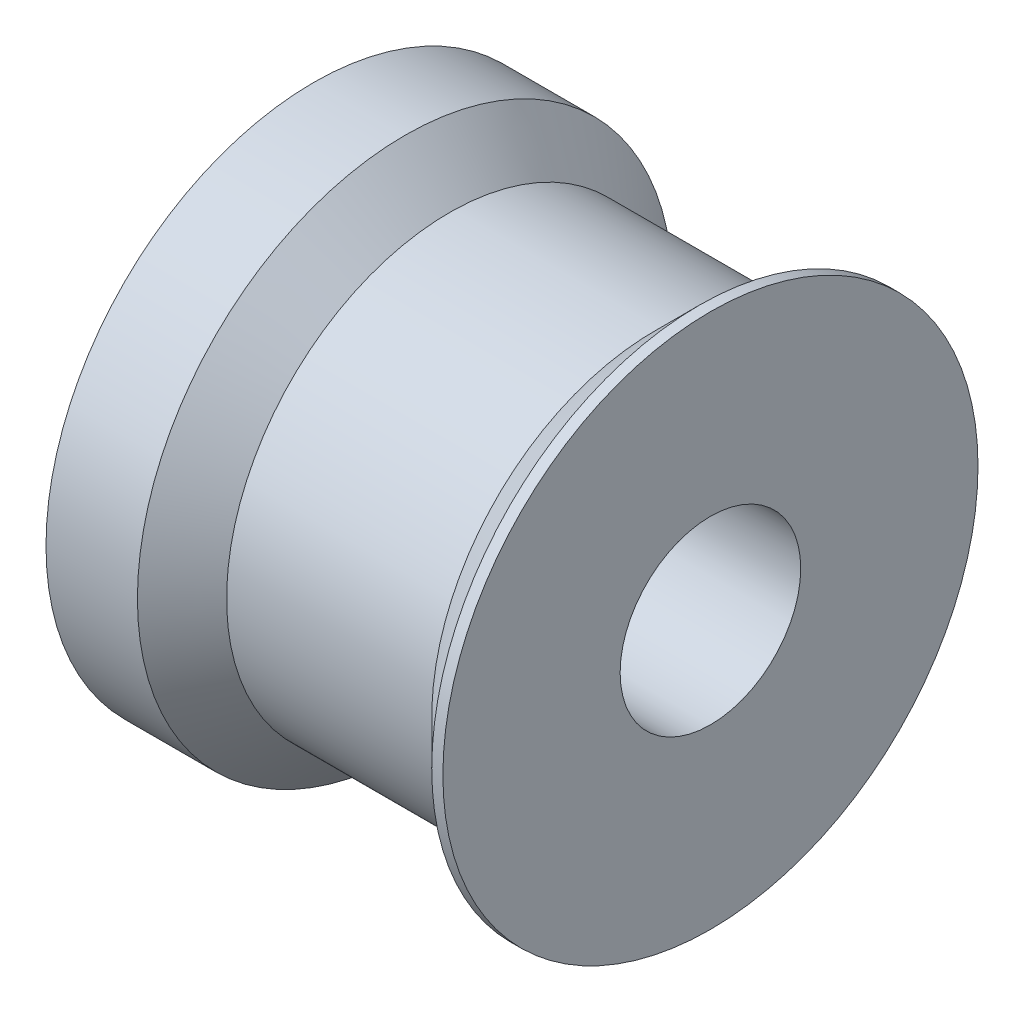
ISO-10303-21;
HEADER;
FILE_DESCRIPTION(('STEP AP214'),'2;1');
FILE_NAME('part.step','',(''),(''),'','','');
FILE_SCHEMA(('AUTOMOTIVE_DESIGN { 1 0 10303 214 1 1 1 1 }'));
ENDSEC;
DATA;
#1=APPLICATION_CONTEXT('core data for automotive mechanical design processes');
#2=APPLICATION_PROTOCOL_DEFINITION('international standard','automotive_design',2000,#1);
#3=PRODUCT_CONTEXT('',#1,'mechanical');
#4=PRODUCT('Part','Part','',(#3));
#5=PRODUCT_RELATED_PRODUCT_CATEGORY('part','',(#4));
#6=PRODUCT_DEFINITION_FORMATION('','',#4);
#7=PRODUCT_DEFINITION_CONTEXT('part definition',#1,'design');
#8=PRODUCT_DEFINITION('design','',#6,#7);
#9=PRODUCT_DEFINITION_SHAPE('','',#8);
#10=(LENGTH_UNIT() NAMED_UNIT(*) SI_UNIT(.MILLI.,.METRE.));
#11=(NAMED_UNIT(*) PLANE_ANGLE_UNIT() SI_UNIT($,.RADIAN.));
#12=(NAMED_UNIT(*) SI_UNIT($,.STERADIAN.) SOLID_ANGLE_UNIT());
#13=UNCERTAINTY_MEASURE_WITH_UNIT(LENGTH_MEASURE(1.E-05),#10,'distance_accuracy_value','');
#14=(GEOMETRIC_REPRESENTATION_CONTEXT(3) GLOBAL_UNCERTAINTY_ASSIGNED_CONTEXT((#13)) GLOBAL_UNIT_ASSIGNED_CONTEXT((#10,
#11,#12)) REPRESENTATION_CONTEXT('',''));
#15=CARTESIAN_POINT('',(0.,0.,0.));
#16=DIRECTION('',(0.,0.,1.));
#17=DIRECTION('',(1.,0.,0.));
#18=AXIS2_PLACEMENT_3D('',#15,#16,#17);
#19=CARTESIAN_POINT('',(7.1,0.,0.));
#20=DIRECTION('',(1.,0.,0.));
#21=DIRECTION('',(0.,0.,-1.));
#22=AXIS2_PLACEMENT_3D('',#19,#20,#21);
#23=CYLINDRICAL_SURFACE('',#22,12.);
#24=CARTESIAN_POINT('',(-6.60000000000001,0.,0.));
#25=DIRECTION('',(1.,0.,0.));
#26=DIRECTION('',(0.,0.,-1.));
#27=AXIS2_PLACEMENT_3D('',#24,#25,#26);
#28=CIRCLE('',#27,12.);
#29=CARTESIAN_POINT('',(-6.60000000000001,0.,-12.));
#30=VERTEX_POINT('',#29);
#31=EDGE_CURVE('E10',#30,#30,#28,.T.);
#32=ORIENTED_EDGE('',*,*,#31,.F.);
#33=EDGE_LOOP('',(#32));
#34=FACE_BOUND('',#33,.T.);
#35=CARTESIAN_POINT('',(-10.7,0.,0.));
#36=DIRECTION('',(-1.,0.,0.));
#37=DIRECTION('',(0.,0.,1.));
#38=AXIS2_PLACEMENT_3D('',#35,#36,#37);
#39=CIRCLE('',#38,12.);
#40=CARTESIAN_POINT('',(-10.7,0.,12.));
#41=VERTEX_POINT('',#40);
#42=EDGE_CURVE('E63',#41,#41,#39,.T.);
#43=ORIENTED_EDGE('',*,*,#42,.F.);
#44=EDGE_LOOP('',(#43));
#45=FACE_BOUND('',#44,.T.);
#46=ADVANCED_FACE('F35',(#34,#45),#23,.T.);
#47=CARTESIAN_POINT('',(-6.60000000000001,0.,0.));
#48=DIRECTION('',(-1.,0.,0.));
#49=DIRECTION('',(0.,0.,1.));
#50=AXIS2_PLACEMENT_3D('',#47,#48,#49);
#51=CONICAL_SURFACE('',#50,12.,0.785398163397445);
#52=CARTESIAN_POINT('',(-4.6,0.,0.));
#53=DIRECTION('',(1.,0.,0.));
#54=DIRECTION('',(0.,0.,-1.));
#55=AXIS2_PLACEMENT_3D('',#52,#53,#54);
#56=CIRCLE('',#55,9.99999999999999);
#57=CARTESIAN_POINT('',(-4.6,0.,-9.99999999999999));
#58=VERTEX_POINT('',#57);
#59=EDGE_CURVE('E42',#58,#58,#56,.T.);
#60=ORIENTED_EDGE('',*,*,#59,.F.);
#61=EDGE_LOOP('',(#60));
#62=FACE_BOUND('',#61,.T.);
#63=ORIENTED_EDGE('',*,*,#31,.T.);
#64=EDGE_LOOP('',(#63));
#65=FACE_BOUND('',#64,.T.);
#66=ADVANCED_FACE('F85',(#62,#65),#51,.T.);
#67=CARTESIAN_POINT('',(7.1,0.,0.));
#68=DIRECTION('',(1.,0.,0.));
#69=DIRECTION('',(0.,0.,-1.));
#70=AXIS2_PLACEMENT_3D('',#67,#68,#69);
#71=CYLINDRICAL_SURFACE('',#70,9.99999999999997);
#72=CARTESIAN_POINT('',(4.6,0.,0.));
#73=DIRECTION('',(1.,0.,0.));
#74=DIRECTION('',(0.,0.,-1.));
#75=AXIS2_PLACEMENT_3D('',#72,#73,#74);
#76=CIRCLE('',#75,9.99999999999994);
#77=CARTESIAN_POINT('',(4.6,0.,-9.99999999999994));
#78=VERTEX_POINT('',#77);
#79=EDGE_CURVE('E46',#78,#78,#76,.T.);
#80=ORIENTED_EDGE('',*,*,#79,.F.);
#81=EDGE_LOOP('',(#80));
#82=FACE_BOUND('',#81,.T.);
#83=ORIENTED_EDGE('',*,*,#59,.T.);
#84=EDGE_LOOP('',(#83));
#85=FACE_BOUND('',#84,.T.);
#86=ADVANCED_FACE('F90',(#82,#85),#71,.T.);
#87=CARTESIAN_POINT('',(4.6,0.,0.));
#88=DIRECTION('',(1.,0.,0.));
#89=DIRECTION('',(0.,0.,-1.));
#90=AXIS2_PLACEMENT_3D('',#87,#88,#89);
#91=CONICAL_SURFACE('',#90,9.99999999999994,0.785398163397458);
#92=CARTESIAN_POINT('',(6.60000000000001,0.,0.));
#93=DIRECTION('',(1.,0.,0.));
#94=DIRECTION('',(0.,0.,-1.));
#95=AXIS2_PLACEMENT_3D('',#92,#93,#94);
#96=CIRCLE('',#95,12.);
#97=CARTESIAN_POINT('',(6.60000000000001,0.,-12.));
#98=VERTEX_POINT('',#97);
#99=EDGE_CURVE('E51',#98,#98,#96,.T.);
#100=ORIENTED_EDGE('',*,*,#99,.F.);
#101=EDGE_LOOP('',(#100));
#102=FACE_BOUND('',#101,.T.);
#103=ORIENTED_EDGE('',*,*,#79,.T.);
#104=EDGE_LOOP('',(#103));
#105=FACE_BOUND('',#104,.T.);
#106=ADVANCED_FACE('F97',(#102,#105),#91,.T.);
#107=CARTESIAN_POINT('',(7.1,0.,0.));
#108=DIRECTION('',(1.,0.,0.));
#109=DIRECTION('',(0.,0.,-1.));
#110=AXIS2_PLACEMENT_3D('',#107,#108,#109);
#111=CYLINDRICAL_SURFACE('',#110,12.);
#112=CARTESIAN_POINT('',(7.10000000000001,0.,0.));
#113=DIRECTION('',(1.,0.,0.));
#114=DIRECTION('',(0.,0.,-1.));
#115=AXIS2_PLACEMENT_3D('',#112,#113,#114);
#116=CIRCLE('',#115,12.);
#117=CARTESIAN_POINT('',(7.10000000000001,0.,-12.));
#118=VERTEX_POINT('',#117);
#119=EDGE_CURVE('E54',#118,#118,#116,.T.);
#120=ORIENTED_EDGE('',*,*,#119,.F.);
#121=EDGE_LOOP('',(#120));
#122=FACE_BOUND('',#121,.T.);
#123=ORIENTED_EDGE('',*,*,#99,.T.);
#124=EDGE_LOOP('',(#123));
#125=FACE_BOUND('',#124,.T.);
#126=ADVANCED_FACE('F104',(#122,#125),#111,.T.);
#127=CARTESIAN_POINT('',(7.1,0.,0.));
#128=DIRECTION('',(-1.,0.,0.));
#129=DIRECTION('',(0.,0.,1.));
#130=AXIS2_PLACEMENT_3D('',#127,#128,#129);
#131=PLANE('',#130);
#132=CARTESIAN_POINT('',(7.1,0.,0.));
#133=DIRECTION('',(-1.,0.,0.));
#134=DIRECTION('',(0.,0.,1.));
#135=AXIS2_PLACEMENT_3D('',#132,#133,#134);
#136=CIRCLE('',#135,4.05);
#137=CARTESIAN_POINT('',(7.1,0.,4.05));
#138=VERTEX_POINT('',#137);
#139=EDGE_CURVE('E57',#138,#138,#136,.F.);
#140=ORIENTED_EDGE('',*,*,#139,.F.);
#141=EDGE_LOOP('',(#140));
#142=FACE_BOUND('',#141,.T.);
#143=ORIENTED_EDGE('',*,*,#119,.T.);
#144=EDGE_LOOP('',(#143));
#145=FACE_BOUND('',#144,.T.);
#146=ADVANCED_FACE('F108',(#142,#145),#131,.F.);
#147=CARTESIAN_POINT('',(12.7568542494924,0.,0.));
#148=DIRECTION('',(-1.,0.,0.));
#149=DIRECTION('',(0.,0.,1.));
#150=AXIS2_PLACEMENT_3D('',#147,#148,#149);
#151=CYLINDRICAL_SURFACE('',#150,2.);
#152=CARTESIAN_POINT('',(-5.7,0.,0.));
#153=DIRECTION('',(-1.,0.,0.));
#154=DIRECTION('',(0.,0.,1.));
#155=AXIS2_PLACEMENT_3D('',#152,#153,#154);
#156=CIRCLE('',#155,2.);
#157=CARTESIAN_POINT('',(-5.7,0.,2.));
#158=VERTEX_POINT('',#157);
#159=EDGE_CURVE('E38',#158,#158,#156,.F.);
#160=CARTESIAN_POINT('',(-10.7,0.,0.));
#161=DIRECTION('',(-1.,0.,0.));
#162=DIRECTION('',(0.,0.,1.));
#163=AXIS2_PLACEMENT_3D('',#160,#161,#162);
#164=CIRCLE('',#163,2.);
#165=CARTESIAN_POINT('',(-10.7,0.,2.));
#166=VERTEX_POINT('',#165);
#167=EDGE_CURVE('E66',#166,#166,#164,.T.);
#168=CARTESIAN_POINT('',(-5.7,0.,2.));
#169=CARTESIAN_POINT('',(-5.75208333333333,0.,2.));
#170=CARTESIAN_POINT('',(-5.80416666666667,0.,2.));
#171=CARTESIAN_POINT('',(-5.90833333333333,0.,2.));
#172=CARTESIAN_POINT('',(-5.96041666666667,0.,2.));
#173=CARTESIAN_POINT('',(-6.06458333333333,0.,2.));
#174=CARTESIAN_POINT('',(-6.11666666666667,0.,2.));
#175=CARTESIAN_POINT('',(-6.22083333333333,0.,2.));
#176=CARTESIAN_POINT('',(-6.27291666666667,0.,2.));
#177=CARTESIAN_POINT('',(-6.37708333333333,0.,2.));
#178=CARTESIAN_POINT('',(-6.42916666666667,0.,2.));
#179=CARTESIAN_POINT('',(-6.53333333333333,0.,2.));
#180=CARTESIAN_POINT('',(-6.58541666666667,0.,2.));
#181=CARTESIAN_POINT('',(-6.68958333333333,0.,2.));
#182=CARTESIAN_POINT('',(-6.74166666666667,0.,2.));
#183=CARTESIAN_POINT('',(-6.84583333333333,0.,2.));
#184=CARTESIAN_POINT('',(-6.89791666666667,0.,2.));
#185=CARTESIAN_POINT('',(-7.00208333333333,0.,2.));
#186=CARTESIAN_POINT('',(-7.05416666666667,0.,2.));
#187=CARTESIAN_POINT('',(-7.15833333333333,0.,2.));
#188=CARTESIAN_POINT('',(-7.21041666666666,0.,2.));
#189=CARTESIAN_POINT('',(-7.31458333333333,0.,2.));
#190=CARTESIAN_POINT('',(-7.36666666666666,0.,2.));
#191=CARTESIAN_POINT('',(-7.47083333333333,0.,2.));
#192=CARTESIAN_POINT('',(-7.52291666666666,0.,2.));
#193=CARTESIAN_POINT('',(-7.62708333333333,0.,2.));
#194=CARTESIAN_POINT('',(-7.67916666666666,0.,2.));
#195=CARTESIAN_POINT('',(-7.78333333333333,0.,2.));
#196=CARTESIAN_POINT('',(-7.83541666666667,0.,2.));
#197=CARTESIAN_POINT('',(-7.93958333333333,0.,2.));
#198=CARTESIAN_POINT('',(-7.99166666666667,0.,2.));
#199=CARTESIAN_POINT('',(-8.09583333333333,0.,2.));
#200=CARTESIAN_POINT('',(-8.14791666666667,0.,2.));
#201=CARTESIAN_POINT('',(-8.25208333333333,0.,2.));
#202=CARTESIAN_POINT('',(-8.30416666666667,0.,2.));
#203=CARTESIAN_POINT('',(-8.40833333333333,0.,2.));
#204=CARTESIAN_POINT('',(-8.46041666666667,0.,2.));
#205=CARTESIAN_POINT('',(-8.56458333333333,0.,2.));
#206=CARTESIAN_POINT('',(-8.61666666666667,0.,2.));
#207=CARTESIAN_POINT('',(-8.72083333333333,0.,2.));
#208=CARTESIAN_POINT('',(-8.77291666666667,0.,2.));
#209=CARTESIAN_POINT('',(-8.87708333333333,0.,2.));
#210=CARTESIAN_POINT('',(-8.92916666666667,0.,2.));
#211=CARTESIAN_POINT('',(-9.03333333333333,0.,2.));
#212=CARTESIAN_POINT('',(-9.08541666666667,0.,2.));
#213=CARTESIAN_POINT('',(-9.18958333333333,0.,2.));
#214=CARTESIAN_POINT('',(-9.24166666666667,0.,2.));
#215=CARTESIAN_POINT('',(-9.34583333333333,0.,2.));
#216=CARTESIAN_POINT('',(-9.39791666666666,0.,2.));
#217=CARTESIAN_POINT('',(-9.50208333333333,0.,2.));
#218=CARTESIAN_POINT('',(-9.55416666666667,0.,2.));
#219=CARTESIAN_POINT('',(-9.65833333333333,0.,2.));
#220=CARTESIAN_POINT('',(-9.71041666666666,0.,2.));
#221=CARTESIAN_POINT('',(-9.81458333333333,0.,2.));
#222=CARTESIAN_POINT('',(-9.86666666666666,0.,2.));
#223=CARTESIAN_POINT('',(-9.97083333333333,0.,2.));
#224=CARTESIAN_POINT('',(-10.0229166666667,0.,2.));
#225=CARTESIAN_POINT('',(-10.1270833333333,0.,2.));
#226=CARTESIAN_POINT('',(-10.1791666666667,0.,2.));
#227=CARTESIAN_POINT('',(-10.2833333333333,0.,2.));
#228=CARTESIAN_POINT('',(-10.3354166666667,0.,2.));
#229=CARTESIAN_POINT('',(-10.4395833333333,0.,2.));
#230=CARTESIAN_POINT('',(-10.4916666666667,0.,2.));
#231=CARTESIAN_POINT('',(-10.5958333333333,0.,2.));
#232=CARTESIAN_POINT('',(-10.6479166666667,0.,2.));
#233=CARTESIAN_POINT('',(-10.7,0.,2.));
#234=B_SPLINE_CURVE_WITH_KNOTS('',3,(#168,#169,#170,#171,#172,#173,#174,#175,#176,#177,#178,
#179,#180,#181,#182,#183,#184,#185,#186,#187,#188,#189,#190,#191,#192,#193,#194,#195,#196,#197,
#198,#199,#200,#201,#202,#203,#204,#205,#206,#207,#208,#209,#210,#211,#212,#213,#214,#215,#216,
#217,#218,#219,#220,#221,#222,#223,#224,#225,#226,#227,#228,#229,#230,#231,#232,#233),
.UNSPECIFIED.,.F.,.F.,(4,2,2,2,2,2,2,2,2,2,2,2,2,2,2,2,2,2,2,2,2,2,2,2,2,2,2,2,2,2,2,2,4),(0.,
0.15625,0.3125,0.46875,0.625000000000001,0.781250000000001,0.937500000000001,1.09375,1.25,
1.40625,1.5625,1.71875,1.875,2.03125,2.1875,2.34375,2.5,2.65625,2.8125,2.96875,3.125,3.28125,
3.4375,3.59375,3.75,3.90625,4.0625,4.21875,4.375,4.53125,4.6875,4.84375,5.),.UNSPECIFIED.);
#235=EDGE_CURVE('BSEAM70',#158,#166,#234,.T.);
#236=ORIENTED_EDGE('',*,*,#159,.T.);
#237=ORIENTED_EDGE('',*,*,#167,.T.);
#238=ORIENTED_EDGE('',*,*,#235,.T.);
#239=ORIENTED_EDGE('',*,*,#235,.F.);
#240=EDGE_LOOP('',(#236,#238,#237,#239));
#241=FACE_BOUND('',#240,.T.);
#242=ADVANCED_FACE('F70',(#241),#151,.F.);
#243=CARTESIAN_POINT('',(-5.7,0.,0.));
#244=DIRECTION('',(-1.,0.,0.));
#245=DIRECTION('',(0.,0.,1.));
#246=AXIS2_PLACEMENT_3D('',#243,#244,#245);
#247=PLANE('',#246);
#248=CARTESIAN_POINT('',(-5.7,0.,0.));
#249=DIRECTION('',(-1.,0.,0.));
#250=DIRECTION('',(0.,0.,1.));
#251=AXIS2_PLACEMENT_3D('',#248,#249,#250);
#252=CIRCLE('',#251,4.05);
#253=CARTESIAN_POINT('',(-5.7,0.,4.05));
#254=VERTEX_POINT('',#253);
#255=EDGE_CURVE('E60',#254,#254,#252,.T.);
#256=ORIENTED_EDGE('',*,*,#255,.F.);
#257=EDGE_LOOP('',(#256));
#258=FACE_BOUND('',#257,.T.);
#259=ORIENTED_EDGE('',*,*,#159,.F.);
#260=EDGE_LOOP('',(#259));
#261=FACE_BOUND('',#260,.T.);
#262=ADVANCED_FACE('F80',(#258,#261),#247,.F.);
#263=CARTESIAN_POINT('',(18.5551298552221,0.,0.));
#264=DIRECTION('',(-1.,0.,0.));
#265=DIRECTION('',(0.,0.,1.));
#266=AXIS2_PLACEMENT_3D('',#263,#264,#265);
#267=CYLINDRICAL_SURFACE('',#266,4.05);
#268=CARTESIAN_POINT('',(7.1,0.,4.05));
#269=CARTESIAN_POINT('',(6.96666666666667,0.,4.05));
#270=CARTESIAN_POINT('',(6.83333333333334,0.,4.05));
#271=CARTESIAN_POINT('',(6.56666666666667,0.,4.05));
#272=CARTESIAN_POINT('',(6.43333333333334,0.,4.05));
#273=CARTESIAN_POINT('',(6.16666666666667,0.,4.05));
#274=CARTESIAN_POINT('',(6.03333333333334,0.,4.05));
#275=CARTESIAN_POINT('',(5.76666666666667,0.,4.05));
#276=CARTESIAN_POINT('',(5.63333333333334,0.,4.05));
#277=CARTESIAN_POINT('',(5.36666666666667,0.,4.05));
#278=CARTESIAN_POINT('',(5.23333333333334,0.,4.05));
#279=CARTESIAN_POINT('',(4.96666666666667,0.,4.05));
#280=CARTESIAN_POINT('',(4.83333333333334,0.,4.05));
#281=CARTESIAN_POINT('',(4.56666666666667,0.,4.05));
#282=CARTESIAN_POINT('',(4.43333333333334,0.,4.05));
#283=CARTESIAN_POINT('',(4.16666666666667,0.,4.05));
#284=CARTESIAN_POINT('',(4.03333333333334,0.,4.05));
#285=CARTESIAN_POINT('',(3.76666666666667,0.,4.05));
#286=CARTESIAN_POINT('',(3.63333333333334,0.,4.05));
#287=CARTESIAN_POINT('',(3.36666666666667,0.,4.05));
#288=CARTESIAN_POINT('',(3.23333333333334,0.,4.05));
#289=CARTESIAN_POINT('',(2.96666666666667,0.,4.05));
#290=CARTESIAN_POINT('',(2.83333333333334,0.,4.05));
#291=CARTESIAN_POINT('',(2.56666666666667,0.,4.05));
#292=CARTESIAN_POINT('',(2.43333333333334,0.,4.05));
#293=CARTESIAN_POINT('',(2.16666666666667,0.,4.05));
#294=CARTESIAN_POINT('',(2.03333333333334,0.,4.05));
#295=CARTESIAN_POINT('',(1.76666666666667,0.,4.05));
#296=CARTESIAN_POINT('',(1.63333333333334,0.,4.05));
#297=CARTESIAN_POINT('',(1.36666666666667,0.,4.05));
#298=CARTESIAN_POINT('',(1.23333333333334,0.,4.05));
#299=CARTESIAN_POINT('',(0.96666666666667,0.,4.05));
#300=CARTESIAN_POINT('',(0.833333333333336,0.,4.05));
#301=CARTESIAN_POINT('',(0.566666666666669,0.,4.05));
#302=CARTESIAN_POINT('',(0.433333333333335,0.,4.05));
#303=CARTESIAN_POINT('',(0.166666666666668,0.,4.05));
#304=CARTESIAN_POINT('',(0.0333333333333343,0.,4.05));
#305=CARTESIAN_POINT('',(-0.233333333333332,0.,4.05));
#306=CARTESIAN_POINT('',(-0.366666666666664,0.,4.05));
#307=CARTESIAN_POINT('',(-0.633333333333331,0.,4.05));
#308=CARTESIAN_POINT('',(-0.766666666666664,0.,4.05));
#309=CARTESIAN_POINT('',(-1.03333333333333,0.,4.05));
#310=CARTESIAN_POINT('',(-1.16666666666667,0.,4.05));
#311=CARTESIAN_POINT('',(-1.43333333333333,0.,4.05));
#312=CARTESIAN_POINT('',(-1.56666666666666,0.,4.05));
#313=CARTESIAN_POINT('',(-1.83333333333333,0.,4.05));
#314=CARTESIAN_POINT('',(-1.96666666666666,0.,4.05));
#315=CARTESIAN_POINT('',(-2.23333333333333,0.,4.05));
#316=CARTESIAN_POINT('',(-2.36666666666666,0.,4.05));
#317=CARTESIAN_POINT('',(-2.63333333333333,0.,4.05));
#318=CARTESIAN_POINT('',(-2.76666666666667,0.,4.05));
#319=CARTESIAN_POINT('',(-3.03333333333333,0.,4.05));
#320=CARTESIAN_POINT('',(-3.16666666666667,0.,4.05));
#321=CARTESIAN_POINT('',(-3.43333333333333,0.,4.05));
#322=CARTESIAN_POINT('',(-3.56666666666667,0.,4.05));
#323=CARTESIAN_POINT('',(-3.83333333333333,0.,4.05));
#324=CARTESIAN_POINT('',(-3.96666666666667,0.,4.05));
#325=CARTESIAN_POINT('',(-4.23333333333333,0.,4.05));
#326=CARTESIAN_POINT('',(-4.36666666666667,0.,4.05));
#327=CARTESIAN_POINT('',(-4.63333333333333,0.,4.05));
#328=CARTESIAN_POINT('',(-4.76666666666667,0.,4.05));
#329=CARTESIAN_POINT('',(-5.03333333333333,0.,4.05));
#330=CARTESIAN_POINT('',(-5.16666666666667,0.,4.05));
#331=CARTESIAN_POINT('',(-5.43333333333333,0.,4.05));
#332=CARTESIAN_POINT('',(-5.56666666666667,0.,4.05));
#333=CARTESIAN_POINT('',(-5.7,0.,4.05));
#334=B_SPLINE_CURVE_WITH_KNOTS('',3,(#268,#269,#270,#271,#272,#273,#274,#275,#276,#277,#278,
#279,#280,#281,#282,#283,#284,#285,#286,#287,#288,#289,#290,#291,#292,#293,#294,#295,#296,#297,
#298,#299,#300,#301,#302,#303,#304,#305,#306,#307,#308,#309,#310,#311,#312,#313,#314,#315,#316,
#317,#318,#319,#320,#321,#322,#323,#324,#325,#326,#327,#328,#329,#330,#331,#332,#333),
.UNSPECIFIED.,.F.,.F.,(4,2,2,2,2,2,2,2,2,2,2,2,2,2,2,2,2,2,2,2,2,2,2,2,2,2,2,2,2,2,2,2,4),(0.,
0.400000000000001,0.8,1.2,1.6,2.,2.4,2.8,3.2,3.6,4.,4.4,4.8,5.2,5.6,6.,6.4,6.8,7.2,7.6,8.,8.4,
8.8,9.2,9.6,10.,10.4,10.8,11.2,11.6,12.,12.4,12.8),.UNSPECIFIED.);
#335=EDGE_CURVE('BSEAM74',#138,#254,#334,.T.);
#336=ORIENTED_EDGE('',*,*,#139,.T.);
#337=ORIENTED_EDGE('',*,*,#255,.T.);
#338=ORIENTED_EDGE('',*,*,#335,.T.);
#339=ORIENTED_EDGE('',*,*,#335,.F.);
#340=EDGE_LOOP('',(#336,#338,#337,#339));
#341=FACE_BOUND('',#340,.T.);
#342=ADVANCED_FACE('F74',(#341),#267,.F.);
#343=CARTESIAN_POINT('',(-10.7,0.,0.));
#344=DIRECTION('',(-1.,0.,0.));
#345=DIRECTION('',(0.,0.,1.));
#346=AXIS2_PLACEMENT_3D('',#343,#344,#345);
#347=PLANE('',#346);
#348=ORIENTED_EDGE('',*,*,#42,.T.);
#349=EDGE_LOOP('',(#348));
#350=FACE_BOUND('',#349,.T.);
#351=ORIENTED_EDGE('',*,*,#167,.F.);
#352=EDGE_LOOP('',(#351));
#353=FACE_BOUND('',#352,.T.);
#354=ADVANCED_FACE('F72',(#350,#353),#347,.T.);
#355=CLOSED_SHELL('',(#46,#66,#86,#106,#126,#146,#242,#262,#342,#354));
#356=MANIFOLD_SOLID_BREP('B2',#355);
#357=ADVANCED_BREP_SHAPE_REPRESENTATION('',(#18,#356),#14);
#358=SHAPE_DEFINITION_REPRESENTATION(#9,#357);
ENDSEC;
END-ISO-10303-21;
